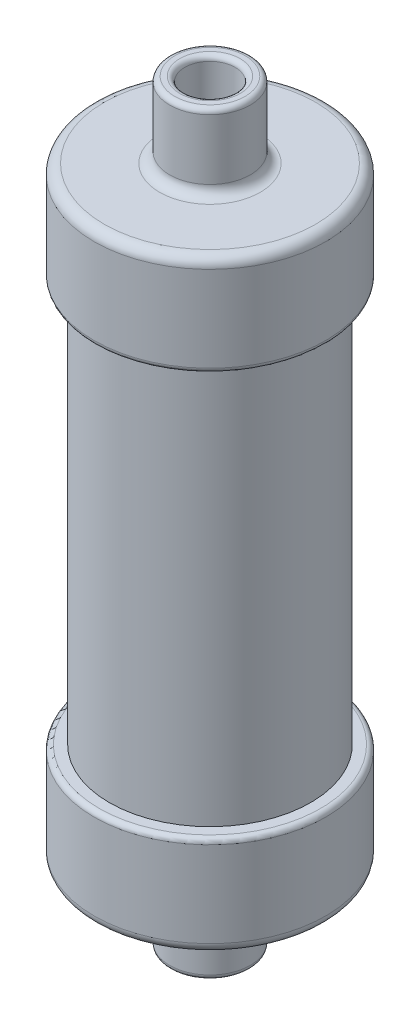
ISO-10303-21;
HEADER;
FILE_DESCRIPTION(('STEP AP214'),'2;1');
FILE_NAME('part.step','',(''),(''),'','','');
FILE_SCHEMA(('AUTOMOTIVE_DESIGN { 1 0 10303 214 1 1 1 1 }'));
ENDSEC;
DATA;
#1=APPLICATION_CONTEXT('core data for automotive mechanical design processes');
#2=APPLICATION_PROTOCOL_DEFINITION('international standard','automotive_design',2000,#1);
#3=PRODUCT_CONTEXT('',#1,'mechanical');
#4=PRODUCT('Part','Part','',(#3));
#5=PRODUCT_RELATED_PRODUCT_CATEGORY('part','',(#4));
#6=PRODUCT_DEFINITION_FORMATION('','',#4);
#7=PRODUCT_DEFINITION_CONTEXT('part definition',#1,'design');
#8=PRODUCT_DEFINITION('design','',#6,#7);
#9=PRODUCT_DEFINITION_SHAPE('','',#8);
#10=(LENGTH_UNIT() NAMED_UNIT(*) SI_UNIT(.MILLI.,.METRE.));
#11=(NAMED_UNIT(*) PLANE_ANGLE_UNIT() SI_UNIT($,.RADIAN.));
#12=(NAMED_UNIT(*) SI_UNIT($,.STERADIAN.) SOLID_ANGLE_UNIT());
#13=UNCERTAINTY_MEASURE_WITH_UNIT(LENGTH_MEASURE(1.E-05),#10,'distance_accuracy_value','');
#14=(GEOMETRIC_REPRESENTATION_CONTEXT(3) GLOBAL_UNCERTAINTY_ASSIGNED_CONTEXT((#13)) GLOBAL_UNIT_ASSIGNED_CONTEXT((#10,
#11,#12)) REPRESENTATION_CONTEXT('',''));
#15=CARTESIAN_POINT('',(0.,0.,0.));
#16=DIRECTION('',(0.,0.,1.));
#17=DIRECTION('',(1.,0.,0.));
#18=AXIS2_PLACEMENT_3D('',#15,#16,#17);
#19=CARTESIAN_POINT('',(0.,-60.,0.));
#20=DIRECTION('',(0.,-1.,0.));
#21=DIRECTION('',(0.,0.,1.));
#22=AXIS2_PLACEMENT_3D('',#19,#20,#21);
#23=PLANE('',#22);
#24=CARTESIAN_POINT('',(0.,-60.,0.));
#25=DIRECTION('',(0.,1.,0.));
#26=DIRECTION('',(0.,0.,1.));
#27=AXIS2_PLACEMENT_3D('',#24,#25,#26);
#28=CIRCLE('',#27,10.);
#29=CARTESIAN_POINT('',(0.,-60.,10.));
#30=VERTEX_POINT('',#29);
#31=EDGE_CURVE('E85',#30,#30,#28,.F.);
#32=ORIENTED_EDGE('',*,*,#31,.F.);
#33=EDGE_LOOP('',(#32));
#34=FACE_BOUND('',#33,.T.);
#35=CARTESIAN_POINT('',(0.,-60.,0.));
#36=DIRECTION('',(0.,1.,0.));
#37=DIRECTION('',(0.,0.,1.));
#38=AXIS2_PLACEMENT_3D('',#35,#36,#37);
#39=CIRCLE('',#38,21.);
#40=CARTESIAN_POINT('',(0.,-60.,21.));
#41=VERTEX_POINT('',#40);
#42=EDGE_CURVE('E88',#41,#41,#39,.T.);
#43=ORIENTED_EDGE('',*,*,#42,.F.);
#44=EDGE_LOOP('',(#43));
#45=FACE_BOUND('',#44,.T.);
#46=ADVANCED_FACE('F56',(#34,#45),#23,.T.);
#47=CARTESIAN_POINT('',(0.,-40.,0.));
#48=DIRECTION('',(0.,-1.,0.));
#49=DIRECTION('',(0.,0.,1.));
#50=AXIS2_PLACEMENT_3D('',#47,#48,#49);
#51=CYLINDRICAL_SURFACE('',#50,23.);
#52=CARTESIAN_POINT('',(0.,-41.,0.));
#53=DIRECTION('',(0.,1.,0.));
#54=DIRECTION('',(0.,0.,1.));
#55=AXIS2_PLACEMENT_3D('',#52,#53,#54);
#56=CIRCLE('',#55,23.);
#57=CARTESIAN_POINT('',(0.,-41.,23.));
#58=VERTEX_POINT('',#57);
#59=EDGE_CURVE('E79',#58,#58,#56,.T.);
#60=ORIENTED_EDGE('',*,*,#59,.F.);
#61=EDGE_LOOP('',(#60));
#62=FACE_BOUND('',#61,.T.);
#63=CARTESIAN_POINT('',(0.,-58.,0.));
#64=DIRECTION('',(0.,1.,0.));
#65=DIRECTION('',(0.,0.,1.));
#66=AXIS2_PLACEMENT_3D('',#63,#64,#65);
#67=CIRCLE('',#66,23.);
#68=CARTESIAN_POINT('',(0.,-58.,23.));
#69=VERTEX_POINT('',#68);
#70=EDGE_CURVE('E82',#69,#69,#67,.F.);
#71=ORIENTED_EDGE('',*,*,#70,.F.);
#72=EDGE_LOOP('',(#71));
#73=FACE_BOUND('',#72,.T.);
#74=ADVANCED_FACE('F124',(#62,#73),#51,.T.);
#75=CARTESIAN_POINT('',(0.,-40.,0.));
#76=DIRECTION('',(0.,-1.,0.));
#77=DIRECTION('',(0.,0.,1.));
#78=AXIS2_PLACEMENT_3D('',#75,#76,#77);
#79=PLANE('',#78);
#80=CARTESIAN_POINT('',(0.,-40.,0.));
#81=DIRECTION('',(0.,1.,0.));
#82=DIRECTION('',(0.,0.,1.));
#83=AXIS2_PLACEMENT_3D('',#80,#81,#82);
#84=CIRCLE('',#83,22.);
#85=CARTESIAN_POINT('',(0.,-40.,22.));
#86=VERTEX_POINT('',#85);
#87=EDGE_CURVE('E76',#86,#86,#84,.F.);
#88=ORIENTED_EDGE('',*,*,#87,.F.);
#89=EDGE_LOOP('',(#88));
#90=FACE_BOUND('',#89,.T.);
#91=CARTESIAN_POINT('',(0.,-40.,0.));
#92=DIRECTION('',(0.,1.,0.));
#93=DIRECTION('',(0.,0.,1.));
#94=AXIS2_PLACEMENT_3D('',#91,#92,#93);
#95=CIRCLE('',#94,20.);
#96=CARTESIAN_POINT('',(0.,-40.,20.));
#97=VERTEX_POINT('',#96);
#98=EDGE_CURVE('E94',#97,#97,#95,.T.);
#99=ORIENTED_EDGE('',*,*,#98,.F.);
#100=EDGE_LOOP('',(#99));
#101=FACE_BOUND('',#100,.T.);
#102=ADVANCED_FACE('F118',(#90,#101),#79,.F.);
#103=CARTESIAN_POINT('',(0.,-40.,0.));
#104=DIRECTION('',(0.,-1.,0.));
#105=DIRECTION('',(0.,0.,1.));
#106=AXIS2_PLACEMENT_3D('',#103,#104,#105);
#107=CYLINDRICAL_SURFACE('',#106,20.);
#108=ORIENTED_EDGE('',*,*,#98,.T.);
#109=EDGE_LOOP('',(#108));
#110=FACE_BOUND('',#109,.T.);
#111=CARTESIAN_POINT('',(0.,-50.,0.));
#112=DIRECTION('',(0.,1.,0.));
#113=DIRECTION('',(0.,0.,1.));
#114=AXIS2_PLACEMENT_3D('',#111,#112,#113);
#115=CIRCLE('',#114,20.);
#116=CARTESIAN_POINT('',(0.,-50.,20.));
#117=VERTEX_POINT('',#116);
#118=EDGE_CURVE('E98',#117,#117,#115,.F.);
#119=ORIENTED_EDGE('',*,*,#118,.T.);
#120=EDGE_LOOP('',(#119));
#121=FACE_BOUND('',#120,.T.);
#122=ADVANCED_FACE('F104',(#110,#121),#107,.F.);
#123=CARTESIAN_POINT('',(0.,-50.,0.));
#124=DIRECTION('',(0.,-1.,0.));
#125=DIRECTION('',(0.,0.,1.));
#126=AXIS2_PLACEMENT_3D('',#123,#124,#125);
#127=PLANE('',#126);
#128=CARTESIAN_POINT('',(0.,-50.,0.));
#129=DIRECTION('',(0.,1.,0.));
#130=DIRECTION('',(0.,0.,1.));
#131=AXIS2_PLACEMENT_3D('',#128,#129,#130);
#132=CIRCLE('',#131,5.);
#133=CARTESIAN_POINT('',(0.,-50.,5.));
#134=VERTEX_POINT('',#133);
#135=EDGE_CURVE('E95',#134,#134,#132,.T.);
#136=ORIENTED_EDGE('',*,*,#135,.F.);
#137=EDGE_LOOP('',(#136));
#138=FACE_BOUND('',#137,.T.);
#139=ORIENTED_EDGE('',*,*,#118,.F.);
#140=EDGE_LOOP('',(#139));
#141=FACE_BOUND('',#140,.T.);
#142=ADVANCED_FACE('F106',(#138,#141),#127,.F.);
#143=CARTESIAN_POINT('',(0.,-75.,0.));
#144=DIRECTION('',(0.,-1.,0.));
#145=DIRECTION('',(0.,0.,1.));
#146=AXIS2_PLACEMENT_3D('',#143,#144,#145);
#147=PLANE('',#146);
#148=CARTESIAN_POINT('',(0.,-75.,0.));
#149=DIRECTION('',(0.,1.,0.));
#150=DIRECTION('',(0.,0.,1.));
#151=AXIS2_PLACEMENT_3D('',#148,#149,#150);
#152=CIRCLE('',#151,6.);
#153=CARTESIAN_POINT('',(0.,-75.,6.));
#154=VERTEX_POINT('',#153);
#155=EDGE_CURVE('E63',#154,#154,#152,.F.);
#156=ORIENTED_EDGE('',*,*,#155,.F.);
#157=EDGE_LOOP('',(#156));
#158=FACE_BOUND('',#157,.T.);
#159=CARTESIAN_POINT('',(0.,-75.,0.));
#160=DIRECTION('',(0.,1.,0.));
#161=DIRECTION('',(0.,0.,1.));
#162=AXIS2_PLACEMENT_3D('',#159,#160,#161);
#163=CIRCLE('',#162,7.);
#164=CARTESIAN_POINT('',(0.,-75.,7.));
#165=VERTEX_POINT('',#164);
#166=EDGE_CURVE('E67',#165,#165,#163,.T.);
#167=ORIENTED_EDGE('',*,*,#166,.F.);
#168=EDGE_LOOP('',(#167));
#169=FACE_BOUND('',#168,.T.);
#170=ADVANCED_FACE('F108',(#158,#169),#147,.T.);
#171=CARTESIAN_POINT('',(0.,-75.,0.));
#172=DIRECTION('',(0.,1.,0.));
#173=DIRECTION('',(0.,0.,-1.));
#174=AXIS2_PLACEMENT_3D('',#171,#172,#173);
#175=CYLINDRICAL_SURFACE('',#174,8.);
#176=CARTESIAN_POINT('',(0.,-74.,0.));
#177=DIRECTION('',(0.,1.,0.));
#178=DIRECTION('',(0.,0.,1.));
#179=AXIS2_PLACEMENT_3D('',#176,#177,#178);
#180=CIRCLE('',#179,8.);
#181=CARTESIAN_POINT('',(0.,-74.,8.));
#182=VERTEX_POINT('',#181);
#183=EDGE_CURVE('E12',#182,#182,#180,.F.);
#184=ORIENTED_EDGE('',*,*,#183,.F.);
#185=EDGE_LOOP('',(#184));
#186=FACE_BOUND('',#185,.T.);
#187=CARTESIAN_POINT('',(0.,-62.,0.));
#188=DIRECTION('',(0.,1.,0.));
#189=DIRECTION('',(0.,0.,1.));
#190=AXIS2_PLACEMENT_3D('',#187,#188,#189);
#191=CIRCLE('',#190,8.);
#192=CARTESIAN_POINT('',(0.,-62.,8.));
#193=VERTEX_POINT('',#192);
#194=EDGE_CURVE('E91',#193,#193,#191,.T.);
#195=ORIENTED_EDGE('',*,*,#194,.F.);
#196=EDGE_LOOP('',(#195));
#197=FACE_BOUND('',#196,.T.);
#198=ADVANCED_FACE('F115',(#186,#197),#175,.T.);
#199=CARTESIAN_POINT('',(0.,-75.,0.));
#200=DIRECTION('',(0.,1.,0.));
#201=DIRECTION('',(0.,0.,-1.));
#202=AXIS2_PLACEMENT_3D('',#199,#200,#201);
#203=CYLINDRICAL_SURFACE('',#202,5.);
#204=CARTESIAN_POINT('',(0.,-74.,0.));
#205=DIRECTION('',(0.,1.,0.));
#206=DIRECTION('',(0.,0.,1.));
#207=AXIS2_PLACEMENT_3D('',#204,#205,#206);
#208=CIRCLE('',#207,5.);
#209=CARTESIAN_POINT('',(0.,-74.,5.));
#210=VERTEX_POINT('',#209);
#211=EDGE_CURVE('E71',#210,#210,#208,.T.);
#212=ORIENTED_EDGE('',*,*,#211,.F.);
#213=EDGE_LOOP('',(#212));
#214=FACE_BOUND('',#213,.T.);
#215=ORIENTED_EDGE('',*,*,#135,.T.);
#216=EDGE_LOOP('',(#215));
#217=FACE_BOUND('',#216,.T.);
#218=ADVANCED_FACE('F135',(#214,#217),#203,.F.);
#219=CARTESIAN_POINT('',(0.,-62.,0.));
#220=DIRECTION('',(0.,-1.,0.));
#221=DIRECTION('',(0.,0.,1.));
#222=AXIS2_PLACEMENT_3D('',#219,#220,#221);
#223=TOROIDAL_SURFACE('',#222,10.,2.);
#224=ORIENTED_EDGE('',*,*,#31,.T.);
#225=EDGE_LOOP('',(#224));
#226=FACE_BOUND('',#225,.T.);
#227=ORIENTED_EDGE('',*,*,#194,.T.);
#228=EDGE_LOOP('',(#227));
#229=FACE_BOUND('',#228,.T.);
#230=ADVANCED_FACE('F139',(#226,#229),#223,.F.);
#231=CARTESIAN_POINT('',(0.,-58.,0.));
#232=DIRECTION('',(0.,-1.,0.));
#233=DIRECTION('',(0.,0.,1.));
#234=AXIS2_PLACEMENT_3D('',#231,#232,#233);
#235=TOROIDAL_SURFACE('',#234,21.,2.);
#236=ORIENTED_EDGE('',*,*,#70,.T.);
#237=EDGE_LOOP('',(#236));
#238=FACE_BOUND('',#237,.T.);
#239=ORIENTED_EDGE('',*,*,#42,.T.);
#240=EDGE_LOOP('',(#239));
#241=FACE_BOUND('',#240,.T.);
#242=ADVANCED_FACE('F144',(#238,#241),#235,.T.);
#243=CARTESIAN_POINT('',(0.,-41.,0.));
#244=DIRECTION('',(0.,-1.,0.));
#245=DIRECTION('',(0.,0.,1.));
#246=AXIS2_PLACEMENT_3D('',#243,#244,#245);
#247=TOROIDAL_SURFACE('',#246,22.,1.);
#248=ORIENTED_EDGE('',*,*,#87,.T.);
#249=EDGE_LOOP('',(#248));
#250=FACE_BOUND('',#249,.T.);
#251=ORIENTED_EDGE('',*,*,#59,.T.);
#252=EDGE_LOOP('',(#251));
#253=FACE_BOUND('',#252,.T.);
#254=ADVANCED_FACE('F152',(#250,#253),#247,.T.);
#255=CARTESIAN_POINT('',(0.,-74.,0.));
#256=DIRECTION('',(0.,-1.,0.));
#257=DIRECTION('',(0.,0.,1.));
#258=AXIS2_PLACEMENT_3D('',#255,#256,#257);
#259=TOROIDAL_SURFACE('',#258,6.,1.);
#260=ORIENTED_EDGE('',*,*,#155,.T.);
#261=EDGE_LOOP('',(#260));
#262=FACE_BOUND('',#261,.T.);
#263=ORIENTED_EDGE('',*,*,#211,.T.);
#264=EDGE_LOOP('',(#263));
#265=FACE_BOUND('',#264,.T.);
#266=ADVANCED_FACE('F150',(#262,#265),#259,.T.);
#267=CARTESIAN_POINT('',(0.,-74.,0.));
#268=DIRECTION('',(0.,-1.,0.));
#269=DIRECTION('',(0.,0.,1.));
#270=AXIS2_PLACEMENT_3D('',#267,#268,#269);
#271=TOROIDAL_SURFACE('',#270,7.,1.);
#272=ORIENTED_EDGE('',*,*,#183,.T.);
#273=EDGE_LOOP('',(#272));
#274=FACE_BOUND('',#273,.T.);
#275=ORIENTED_EDGE('',*,*,#166,.T.);
#276=EDGE_LOOP('',(#275));
#277=FACE_BOUND('',#276,.T.);
#278=ADVANCED_FACE('F58',(#274,#277),#271,.T.);
#279=CLOSED_SHELL('',(#46,#74,#102,#122,#142,#170,#198,#218,#230,#242,#254,#266,#278));
#280=MANIFOLD_SOLID_BREP('B2',#279);
#281=CARTESIAN_POINT('',(0.,60.,0.));
#282=DIRECTION('',(0.,1.,0.));
#283=DIRECTION('',(0.,0.,1.));
#284=AXIS2_PLACEMENT_3D('',#281,#282,#283);
#285=PLANE('',#284);
#286=CARTESIAN_POINT('',(0.,60.,0.));
#287=DIRECTION('',(0.,1.,0.));
#288=DIRECTION('',(0.,0.,1.));
#289=AXIS2_PLACEMENT_3D('',#286,#287,#288);
#290=CIRCLE('',#289,10.);
#291=CARTESIAN_POINT('',(0.,60.,10.));
#292=VERTEX_POINT('',#291);
#293=EDGE_CURVE('E308',#292,#292,#290,.F.);
#294=ORIENTED_EDGE('',*,*,#293,.T.);
#295=EDGE_LOOP('',(#294));
#296=FACE_BOUND('',#295,.T.);
#297=CARTESIAN_POINT('',(0.,60.,0.));
#298=DIRECTION('',(0.,1.,0.));
#299=DIRECTION('',(0.,0.,1.));
#300=AXIS2_PLACEMENT_3D('',#297,#298,#299);
#301=CIRCLE('',#300,21.);
#302=CARTESIAN_POINT('',(0.,60.,21.));
#303=VERTEX_POINT('',#302);
#304=EDGE_CURVE('E311',#303,#303,#301,.T.);
#305=ORIENTED_EDGE('',*,*,#304,.T.);
#306=EDGE_LOOP('',(#305));
#307=FACE_BOUND('',#306,.T.);
#308=ADVANCED_FACE('F279',(#296,#307),#285,.T.);
#309=CARTESIAN_POINT('',(0.,40.,0.));
#310=DIRECTION('',(0.,1.,0.));
#311=DIRECTION('',(0.,0.,1.));
#312=AXIS2_PLACEMENT_3D('',#309,#310,#311);
#313=CYLINDRICAL_SURFACE('',#312,23.);
#314=CARTESIAN_POINT('',(0.,41.,0.));
#315=DIRECTION('',(0.,1.,0.));
#316=DIRECTION('',(0.,0.,1.));
#317=AXIS2_PLACEMENT_3D('',#314,#315,#316);
#318=CIRCLE('',#317,23.);
#319=CARTESIAN_POINT('',(0.,41.,23.));
#320=VERTEX_POINT('',#319);
#321=EDGE_CURVE('E302',#320,#320,#318,.T.);
#322=ORIENTED_EDGE('',*,*,#321,.T.);
#323=EDGE_LOOP('',(#322));
#324=FACE_BOUND('',#323,.T.);
#325=CARTESIAN_POINT('',(0.,58.,0.));
#326=DIRECTION('',(0.,1.,0.));
#327=DIRECTION('',(0.,0.,1.));
#328=AXIS2_PLACEMENT_3D('',#325,#326,#327);
#329=CIRCLE('',#328,23.);
#330=CARTESIAN_POINT('',(0.,58.,23.));
#331=VERTEX_POINT('',#330);
#332=EDGE_CURVE('E305',#331,#331,#329,.F.);
#333=ORIENTED_EDGE('',*,*,#332,.T.);
#334=EDGE_LOOP('',(#333));
#335=FACE_BOUND('',#334,.T.);
#336=ADVANCED_FACE('F341',(#324,#335),#313,.T.);
#337=CARTESIAN_POINT('',(0.,40.,0.));
#338=DIRECTION('',(0.,1.,0.));
#339=DIRECTION('',(0.,0.,1.));
#340=AXIS2_PLACEMENT_3D('',#337,#338,#339);
#341=PLANE('',#340);
#342=CARTESIAN_POINT('',(0.,40.,0.));
#343=DIRECTION('',(0.,1.,0.));
#344=DIRECTION('',(0.,0.,1.));
#345=AXIS2_PLACEMENT_3D('',#342,#343,#344);
#346=CIRCLE('',#345,22.);
#347=CARTESIAN_POINT('',(0.,40.,22.));
#348=VERTEX_POINT('',#347);
#349=EDGE_CURVE('E299',#348,#348,#346,.F.);
#350=ORIENTED_EDGE('',*,*,#349,.T.);
#351=EDGE_LOOP('',(#350));
#352=FACE_BOUND('',#351,.T.);
#353=CARTESIAN_POINT('',(0.,40.,0.));
#354=DIRECTION('',(0.,1.,0.));
#355=DIRECTION('',(0.,0.,1.));
#356=AXIS2_PLACEMENT_3D('',#353,#354,#355);
#357=CIRCLE('',#356,20.);
#358=CARTESIAN_POINT('',(0.,40.,20.));
#359=VERTEX_POINT('',#358);
#360=EDGE_CURVE('E317',#359,#359,#357,.T.);
#361=ORIENTED_EDGE('',*,*,#360,.T.);
#362=EDGE_LOOP('',(#361));
#363=FACE_BOUND('',#362,.T.);
#364=ADVANCED_FACE('F331',(#352,#363),#341,.F.);
#365=CARTESIAN_POINT('',(0.,40.,0.));
#366=DIRECTION('',(0.,1.,0.));
#367=DIRECTION('',(0.,0.,1.));
#368=AXIS2_PLACEMENT_3D('',#365,#366,#367);
#369=CYLINDRICAL_SURFACE('',#368,20.);
#370=ORIENTED_EDGE('',*,*,#360,.F.);
#371=EDGE_LOOP('',(#370));
#372=FACE_BOUND('',#371,.T.);
#373=CARTESIAN_POINT('',(0.,50.,0.));
#374=DIRECTION('',(0.,1.,0.));
#375=DIRECTION('',(0.,0.,1.));
#376=AXIS2_PLACEMENT_3D('',#373,#374,#375);
#377=CIRCLE('',#376,20.);
#378=CARTESIAN_POINT('',(0.,50.,20.));
#379=VERTEX_POINT('',#378);
#380=EDGE_CURVE('E321',#379,#379,#377,.F.);
#381=ORIENTED_EDGE('',*,*,#380,.F.);
#382=EDGE_LOOP('',(#381));
#383=FACE_BOUND('',#382,.T.);
#384=ADVANCED_FACE('F329',(#372,#383),#369,.F.);
#385=CARTESIAN_POINT('',(0.,50.,0.));
#386=DIRECTION('',(0.,1.,0.));
#387=DIRECTION('',(0.,0.,1.));
#388=AXIS2_PLACEMENT_3D('',#385,#386,#387);
#389=PLANE('',#388);
#390=CARTESIAN_POINT('',(0.,50.,0.));
#391=DIRECTION('',(0.,1.,0.));
#392=DIRECTION('',(0.,0.,1.));
#393=AXIS2_PLACEMENT_3D('',#390,#391,#392);
#394=CIRCLE('',#393,5.);
#395=CARTESIAN_POINT('',(0.,50.,5.));
#396=VERTEX_POINT('',#395);
#397=EDGE_CURVE('E318',#396,#396,#394,.T.);
#398=ORIENTED_EDGE('',*,*,#397,.T.);
#399=EDGE_LOOP('',(#398));
#400=FACE_BOUND('',#399,.T.);
#401=ORIENTED_EDGE('',*,*,#380,.T.);
#402=EDGE_LOOP('',(#401));
#403=FACE_BOUND('',#402,.T.);
#404=ADVANCED_FACE('F327',(#400,#403),#389,.F.);
#405=CARTESIAN_POINT('',(0.,75.,0.));
#406=DIRECTION('',(0.,1.,0.));
#407=DIRECTION('',(0.,0.,1.));
#408=AXIS2_PLACEMENT_3D('',#405,#406,#407);
#409=PLANE('',#408);
#410=CARTESIAN_POINT('',(0.,75.,0.));
#411=DIRECTION('',(0.,1.,0.));
#412=DIRECTION('',(0.,0.,1.));
#413=AXIS2_PLACEMENT_3D('',#410,#411,#412);
#414=CIRCLE('',#413,6.);
#415=CARTESIAN_POINT('',(0.,75.,6.));
#416=VERTEX_POINT('',#415);
#417=EDGE_CURVE('E286',#416,#416,#414,.F.);
#418=ORIENTED_EDGE('',*,*,#417,.T.);
#419=EDGE_LOOP('',(#418));
#420=FACE_BOUND('',#419,.T.);
#421=CARTESIAN_POINT('',(0.,75.,0.));
#422=DIRECTION('',(0.,1.,0.));
#423=DIRECTION('',(0.,0.,1.));
#424=AXIS2_PLACEMENT_3D('',#421,#422,#423);
#425=CIRCLE('',#424,7.);
#426=CARTESIAN_POINT('',(0.,75.,7.));
#427=VERTEX_POINT('',#426);
#428=EDGE_CURVE('E290',#427,#427,#425,.T.);
#429=ORIENTED_EDGE('',*,*,#428,.T.);
#430=EDGE_LOOP('',(#429));
#431=FACE_BOUND('',#430,.T.);
#432=ADVANCED_FACE('F338',(#420,#431),#409,.T.);
#433=CARTESIAN_POINT('',(0.,75.,0.));
#434=DIRECTION('',(0.,-1.,0.));
#435=DIRECTION('',(0.,0.,-1.));
#436=AXIS2_PLACEMENT_3D('',#433,#434,#435);
#437=CYLINDRICAL_SURFACE('',#436,8.);
#438=CARTESIAN_POINT('',(0.,74.,0.));
#439=DIRECTION('',(0.,1.,0.));
#440=DIRECTION('',(0.,0.,1.));
#441=AXIS2_PLACEMENT_3D('',#438,#439,#440);
#442=CIRCLE('',#441,8.);
#443=CARTESIAN_POINT('',(0.,74.,8.));
#444=VERTEX_POINT('',#443);
#445=EDGE_CURVE('E55',#444,#444,#442,.F.);
#446=ORIENTED_EDGE('',*,*,#445,.T.);
#447=EDGE_LOOP('',(#446));
#448=FACE_BOUND('',#447,.T.);
#449=CARTESIAN_POINT('',(0.,62.,0.));
#450=DIRECTION('',(0.,1.,0.));
#451=DIRECTION('',(0.,0.,1.));
#452=AXIS2_PLACEMENT_3D('',#449,#450,#451);
#453=CIRCLE('',#452,8.);
#454=CARTESIAN_POINT('',(0.,62.,8.));
#455=VERTEX_POINT('',#454);
#456=EDGE_CURVE('E314',#455,#455,#453,.T.);
#457=ORIENTED_EDGE('',*,*,#456,.T.);
#458=EDGE_LOOP('',(#457));
#459=FACE_BOUND('',#458,.T.);
#460=ADVANCED_FACE('F355',(#448,#459),#437,.T.);
#461=CARTESIAN_POINT('',(0.,75.,0.));
#462=DIRECTION('',(0.,-1.,0.));
#463=DIRECTION('',(0.,0.,-1.));
#464=AXIS2_PLACEMENT_3D('',#461,#462,#463);
#465=CYLINDRICAL_SURFACE('',#464,5.);
#466=CARTESIAN_POINT('',(0.,74.,0.));
#467=DIRECTION('',(0.,1.,0.));
#468=DIRECTION('',(0.,0.,1.));
#469=AXIS2_PLACEMENT_3D('',#466,#467,#468);
#470=CIRCLE('',#469,5.);
#471=CARTESIAN_POINT('',(0.,74.,5.));
#472=VERTEX_POINT('',#471);
#473=EDGE_CURVE('E294',#472,#472,#470,.T.);
#474=ORIENTED_EDGE('',*,*,#473,.T.);
#475=EDGE_LOOP('',(#474));
#476=FACE_BOUND('',#475,.T.);
#477=ORIENTED_EDGE('',*,*,#397,.F.);
#478=EDGE_LOOP('',(#477));
#479=FACE_BOUND('',#478,.T.);
#480=ADVANCED_FACE('F358',(#476,#479),#465,.F.);
#481=CARTESIAN_POINT('',(0.,62.,0.));
#482=DIRECTION('',(0.,1.,0.));
#483=DIRECTION('',(0.,0.,1.));
#484=AXIS2_PLACEMENT_3D('',#481,#482,#483);
#485=TOROIDAL_SURFACE('',#484,10.,2.);
#486=ORIENTED_EDGE('',*,*,#293,.F.);
#487=EDGE_LOOP('',(#486));
#488=FACE_BOUND('',#487,.T.);
#489=ORIENTED_EDGE('',*,*,#456,.F.);
#490=EDGE_LOOP('',(#489));
#491=FACE_BOUND('',#490,.T.);
#492=ADVANCED_FACE('F362',(#488,#491),#485,.F.);
#493=CARTESIAN_POINT('',(0.,58.,0.));
#494=DIRECTION('',(0.,1.,0.));
#495=DIRECTION('',(0.,0.,1.));
#496=AXIS2_PLACEMENT_3D('',#493,#494,#495);
#497=TOROIDAL_SURFACE('',#496,21.,2.);
#498=ORIENTED_EDGE('',*,*,#332,.F.);
#499=EDGE_LOOP('',(#498));
#500=FACE_BOUND('',#499,.T.);
#501=ORIENTED_EDGE('',*,*,#304,.F.);
#502=EDGE_LOOP('',(#501));
#503=FACE_BOUND('',#502,.T.);
#504=ADVANCED_FACE('F367',(#500,#503),#497,.T.);
#505=CARTESIAN_POINT('',(0.,41.,0.));
#506=DIRECTION('',(0.,1.,0.));
#507=DIRECTION('',(0.,0.,1.));
#508=AXIS2_PLACEMENT_3D('',#505,#506,#507);
#509=TOROIDAL_SURFACE('',#508,22.,1.);
#510=ORIENTED_EDGE('',*,*,#349,.F.);
#511=EDGE_LOOP('',(#510));
#512=FACE_BOUND('',#511,.T.);
#513=ORIENTED_EDGE('',*,*,#321,.F.);
#514=EDGE_LOOP('',(#513));
#515=FACE_BOUND('',#514,.T.);
#516=ADVANCED_FACE('F376',(#512,#515),#509,.T.);
#517=CARTESIAN_POINT('',(0.,74.,0.));
#518=DIRECTION('',(0.,1.,0.));
#519=DIRECTION('',(0.,0.,1.));
#520=AXIS2_PLACEMENT_3D('',#517,#518,#519);
#521=TOROIDAL_SURFACE('',#520,6.,1.);
#522=ORIENTED_EDGE('',*,*,#417,.F.);
#523=EDGE_LOOP('',(#522));
#524=FACE_BOUND('',#523,.T.);
#525=ORIENTED_EDGE('',*,*,#473,.F.);
#526=EDGE_LOOP('',(#525));
#527=FACE_BOUND('',#526,.T.);
#528=ADVANCED_FACE('F374',(#524,#527),#521,.T.);
#529=CARTESIAN_POINT('',(0.,74.,0.));
#530=DIRECTION('',(0.,1.,0.));
#531=DIRECTION('',(0.,0.,1.));
#532=AXIS2_PLACEMENT_3D('',#529,#530,#531);
#533=TOROIDAL_SURFACE('',#532,7.,1.);
#534=ORIENTED_EDGE('',*,*,#445,.F.);
#535=EDGE_LOOP('',(#534));
#536=FACE_BOUND('',#535,.T.);
#537=ORIENTED_EDGE('',*,*,#428,.F.);
#538=EDGE_LOOP('',(#537));
#539=FACE_BOUND('',#538,.T.);
#540=ADVANCED_FACE('F281',(#536,#539),#533,.T.);
#541=CLOSED_SHELL('',(#308,#336,#364,#384,#404,#432,#460,#480,#492,#504,#516,#528,#540));
#542=MANIFOLD_SOLID_BREP('B7',#541);
#543=CARTESIAN_POINT('',(0.,-50.,0.));
#544=DIRECTION('',(0.,1.,0.));
#545=DIRECTION('',(0.,0.,1.));
#546=AXIS2_PLACEMENT_3D('',#543,#544,#545);
#547=CYLINDRICAL_SURFACE('',#546,20.);
#548=CARTESIAN_POINT('',(0.,-50.,0.));
#549=DIRECTION('',(0.,1.,0.));
#550=DIRECTION('',(0.,0.,1.));
#551=AXIS2_PLACEMENT_3D('',#548,#549,#550);
#552=CIRCLE('',#551,20.);
#553=CARTESIAN_POINT('',(0.,-50.,20.));
#554=VERTEX_POINT('',#553);
#555=EDGE_CURVE('E278',#554,#554,#552,.T.);
#556=ORIENTED_EDGE('',*,*,#555,.T.);
#557=EDGE_LOOP('',(#556));
#558=FACE_BOUND('',#557,.T.);
#559=CARTESIAN_POINT('',(0.,50.,0.));
#560=DIRECTION('',(0.,1.,0.));
#561=DIRECTION('',(0.,0.,1.));
#562=AXIS2_PLACEMENT_3D('',#559,#560,#561);
#563=CIRCLE('',#562,20.);
#564=CARTESIAN_POINT('',(0.,50.,20.));
#565=VERTEX_POINT('',#564);
#566=EDGE_CURVE('E492',#565,#565,#563,.T.);
#567=ORIENTED_EDGE('',*,*,#566,.F.);
#568=EDGE_LOOP('',(#567));
#569=FACE_BOUND('',#568,.T.);
#570=ADVANCED_FACE('F482',(#558,#569),#547,.T.);
#571=CARTESIAN_POINT('',(0.,-50.,0.));
#572=DIRECTION('',(0.,1.,0.));
#573=DIRECTION('',(0.,0.,1.));
#574=AXIS2_PLACEMENT_3D('',#571,#572,#573);
#575=PLANE('',#574);
#576=CARTESIAN_POINT('',(0.,-50.,0.));
#577=DIRECTION('',(0.,1.,0.));
#578=DIRECTION('',(1.,0.,0.));
#579=AXIS2_PLACEMENT_3D('',#576,#577,#578);
#580=CIRCLE('',#579,17.);
#581=CARTESIAN_POINT('',(17.,-50.,0.));
#582=VERTEX_POINT('',#581);
#583=EDGE_CURVE('E488',#582,#582,#580,.T.);
#584=ORIENTED_EDGE('',*,*,#583,.T.);
#585=EDGE_LOOP('',(#584));
#586=FACE_BOUND('',#585,.T.);
#587=ORIENTED_EDGE('',*,*,#555,.F.);
#588=EDGE_LOOP('',(#587));
#589=FACE_BOUND('',#588,.T.);
#590=ADVANCED_FACE('F511',(#586,#589),#575,.F.);
#591=CARTESIAN_POINT('',(0.,-50.,0.));
#592=DIRECTION('',(0.,1.,0.));
#593=DIRECTION('',(0.,0.,1.));
#594=AXIS2_PLACEMENT_3D('',#591,#592,#593);
#595=CYLINDRICAL_SURFACE('',#594,17.);
#596=ORIENTED_EDGE('',*,*,#583,.F.);
#597=EDGE_LOOP('',(#596));
#598=FACE_BOUND('',#597,.T.);
#599=CARTESIAN_POINT('',(0.,50.,0.));
#600=DIRECTION('',(0.,1.,0.));
#601=DIRECTION('',(1.,0.,0.));
#602=AXIS2_PLACEMENT_3D('',#599,#600,#601);
#603=CIRCLE('',#602,17.);
#604=CARTESIAN_POINT('',(17.,50.,0.));
#605=VERTEX_POINT('',#604);
#606=EDGE_CURVE('E496',#605,#605,#603,.T.);
#607=ORIENTED_EDGE('',*,*,#606,.T.);
#608=EDGE_LOOP('',(#607));
#609=FACE_BOUND('',#608,.T.);
#610=ADVANCED_FACE('F502',(#598,#609),#595,.F.);
#611=CARTESIAN_POINT('',(0.,50.,0.));
#612=DIRECTION('',(0.,1.,0.));
#613=DIRECTION('',(0.,0.,1.));
#614=AXIS2_PLACEMENT_3D('',#611,#612,#613);
#615=PLANE('',#614);
#616=ORIENTED_EDGE('',*,*,#566,.T.);
#617=EDGE_LOOP('',(#616));
#618=FACE_BOUND('',#617,.T.);
#619=ORIENTED_EDGE('',*,*,#606,.F.);
#620=EDGE_LOOP('',(#619));
#621=FACE_BOUND('',#620,.T.);
#622=ADVANCED_FACE('F504',(#618,#621),#615,.T.);
#623=CLOSED_SHELL('',(#570,#590,#610,#622));
#624=MANIFOLD_SOLID_BREP('B50',#623);
#625=ADVANCED_BREP_SHAPE_REPRESENTATION('',(#18,#280,#542,#624),#14);
#626=SHAPE_DEFINITION_REPRESENTATION(#9,#625);
ENDSEC;
END-ISO-10303-21;
